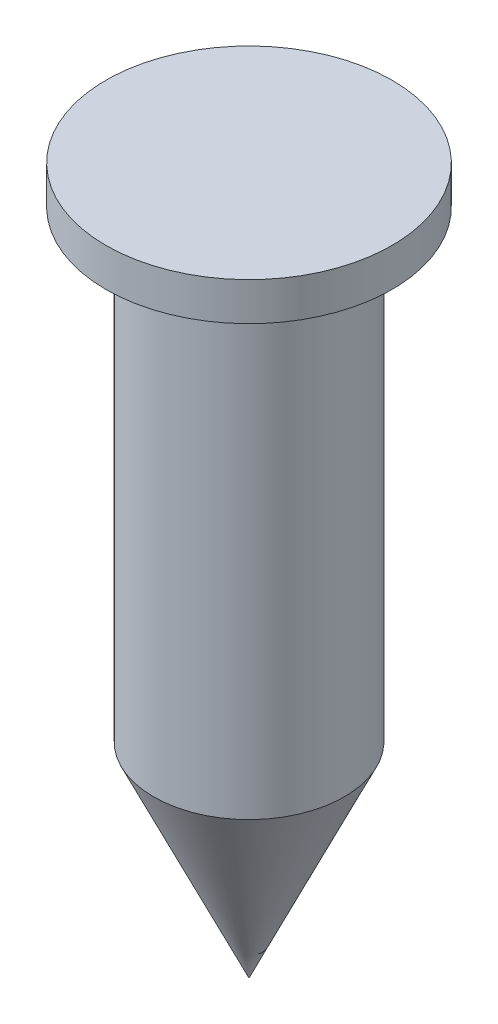
ISO-10303-21;
HEADER;
FILE_DESCRIPTION(('STEP AP214'),'2;1');
FILE_NAME('part.step','',(''),(''),'','','');
FILE_SCHEMA(('AUTOMOTIVE_DESIGN { 1 0 10303 214 1 1 1 1 }'));
ENDSEC;
DATA;
#1=APPLICATION_CONTEXT('core data for automotive mechanical design processes');
#2=APPLICATION_PROTOCOL_DEFINITION('international standard','automotive_design',2000,#1);
#3=PRODUCT_CONTEXT('',#1,'mechanical');
#4=PRODUCT('Part','Part','',(#3));
#5=PRODUCT_RELATED_PRODUCT_CATEGORY('part','',(#4));
#6=PRODUCT_DEFINITION_FORMATION('','',#4);
#7=PRODUCT_DEFINITION_CONTEXT('part definition',#1,'design');
#8=PRODUCT_DEFINITION('design','',#6,#7);
#9=PRODUCT_DEFINITION_SHAPE('','',#8);
#10=(LENGTH_UNIT() NAMED_UNIT(*) SI_UNIT(.MILLI.,.METRE.));
#11=(NAMED_UNIT(*) PLANE_ANGLE_UNIT() SI_UNIT($,.RADIAN.));
#12=(NAMED_UNIT(*) SI_UNIT($,.STERADIAN.) SOLID_ANGLE_UNIT());
#13=UNCERTAINTY_MEASURE_WITH_UNIT(LENGTH_MEASURE(1.E-05),#10,'distance_accuracy_value','');
#14=(GEOMETRIC_REPRESENTATION_CONTEXT(3) GLOBAL_UNCERTAINTY_ASSIGNED_CONTEXT((#13)) GLOBAL_UNIT_ASSIGNED_CONTEXT((#10,
#11,#12)) REPRESENTATION_CONTEXT('',''));
#15=CARTESIAN_POINT('',(0.,0.,0.));
#16=DIRECTION('',(0.,0.,1.));
#17=DIRECTION('',(1.,0.,0.));
#18=AXIS2_PLACEMENT_3D('',#15,#16,#17);
#19=CARTESIAN_POINT('',(0.,0.,0.));
#20=DIRECTION('',(0.,1.,0.));
#21=DIRECTION('',(0.,0.,1.));
#22=AXIS2_PLACEMENT_3D('',#19,#20,#21);
#23=PLANE('',#22);
#24=CARTESIAN_POINT('',(0.,0.,0.));
#25=DIRECTION('',(0.,-1.,0.));
#26=DIRECTION('',(0.,0.,-1.));
#27=AXIS2_PLACEMENT_3D('',#24,#25,#26);
#28=CIRCLE('',#27,7.5);
#29=CARTESIAN_POINT('',(0.,0.,-7.5));
#30=VERTEX_POINT('',#29);
#31=EDGE_CURVE('E11',#30,#30,#28,.T.);
#32=ORIENTED_EDGE('',*,*,#31,.F.);
#33=EDGE_LOOP('',(#32));
#34=FACE_BOUND('',#33,.T.);
#35=ADVANCED_FACE('F39',(#34),#23,.T.);
#36=CARTESIAN_POINT('',(0.,-42.,0.));
#37=DIRECTION('',(0.,-1.,0.));
#38=DIRECTION('',(0.,0.,-1.));
#39=AXIS2_PLACEMENT_3D('',#36,#37,#38);
#40=CYLINDRICAL_SURFACE('',#39,7.5);
#41=ORIENTED_EDGE('',*,*,#31,.T.);
#42=EDGE_LOOP('',(#41));
#43=FACE_BOUND('',#42,.T.);
#44=CARTESIAN_POINT('',(0.,-2.,0.));
#45=DIRECTION('',(0.,-1.,0.));
#46=DIRECTION('',(0.,0.,-1.));
#47=AXIS2_PLACEMENT_3D('',#44,#45,#46);
#48=CIRCLE('',#47,7.5);
#49=CARTESIAN_POINT('',(0.,-2.,-7.5));
#50=VERTEX_POINT('',#49);
#51=EDGE_CURVE('E45',#50,#50,#48,.T.);
#52=ORIENTED_EDGE('',*,*,#51,.F.);
#53=EDGE_LOOP('',(#52));
#54=FACE_BOUND('',#53,.T.);
#55=ADVANCED_FACE('F61',(#43,#54),#40,.T.);
#56=CARTESIAN_POINT('',(7.5,-2.,0.));
#57=DIRECTION('',(0.,-1.,0.));
#58=DIRECTION('',(0.,0.,-1.));
#59=AXIS2_PLACEMENT_3D('',#56,#57,#58);
#60=PLANE('',#59);
#61=ORIENTED_EDGE('',*,*,#51,.T.);
#62=EDGE_LOOP('',(#61));
#63=FACE_BOUND('',#62,.T.);
#64=CARTESIAN_POINT('',(0.,-2.,0.));
#65=DIRECTION('',(0.,-1.,0.));
#66=DIRECTION('',(0.,0.,-1.));
#67=AXIS2_PLACEMENT_3D('',#64,#65,#66);
#68=CIRCLE('',#67,5.);
#69=CARTESIAN_POINT('',(0.,-2.,-5.));
#70=VERTEX_POINT('',#69);
#71=EDGE_CURVE('E72',#70,#70,#68,.T.);
#72=ORIENTED_EDGE('',*,*,#71,.F.);
#73=EDGE_LOOP('',(#72));
#74=FACE_BOUND('',#73,.T.);
#75=ADVANCED_FACE('F56',(#63,#74),#60,.T.);
#76=CARTESIAN_POINT('',(0.,-42.,0.));
#77=DIRECTION('',(0.,-1.,0.));
#78=DIRECTION('',(0.,0.,-1.));
#79=AXIS2_PLACEMENT_3D('',#76,#77,#78);
#80=CYLINDRICAL_SURFACE('',#79,5.);
#81=ORIENTED_EDGE('',*,*,#71,.T.);
#82=EDGE_LOOP('',(#81));
#83=FACE_BOUND('',#82,.T.);
#84=CARTESIAN_POINT('',(0.,-26.2774653974521,0.));
#85=DIRECTION('',(0.,-1.,0.));
#86=DIRECTION('',(0.,0.,-1.));
#87=AXIS2_PLACEMENT_3D('',#84,#85,#86);
#88=CIRCLE('',#87,5.);
#89=CARTESIAN_POINT('',(0.,-26.2774653974521,-5.));
#90=VERTEX_POINT('',#89);
#91=EDGE_CURVE('E74',#90,#90,#88,.T.);
#92=ORIENTED_EDGE('',*,*,#91,.F.);
#93=EDGE_LOOP('',(#92));
#94=FACE_BOUND('',#93,.T.);
#95=ADVANCED_FACE('F50',(#83,#94),#80,.T.);
#96=CARTESIAN_POINT('',(0.,-37.,0.));
#97=DIRECTION('',(0.,1.,0.));
#98=DIRECTION('',(0.,0.,1.));
#99=AXIS2_PLACEMENT_3D('',#96,#97,#98);
#100=CONICAL_SURFACE('',#99,0.,0.43633231299858);
#101=ORIENTED_EDGE('',*,*,#91,.T.);
#102=EDGE_LOOP('',(#101));
#103=FACE_BOUND('',#102,.T.);
#104=CARTESIAN_POINT('',(0.,-37.,0.));
#105=VERTEX_POINT('',#104);
#106=VERTEX_LOOP('',#105);
#107=FACE_BOUND('',#106,.T.);
#108=ADVANCED_FACE('F48',(#103,#107),#100,.T.);
#109=CLOSED_SHELL('',(#35,#55,#75,#95,#108));
#110=MANIFOLD_SOLID_BREP('B2',#109);
#111=ADVANCED_BREP_SHAPE_REPRESENTATION('',(#18,#110),#14);
#112=SHAPE_DEFINITION_REPRESENTATION(#9,#111);
ENDSEC;
END-ISO-10303-21;
